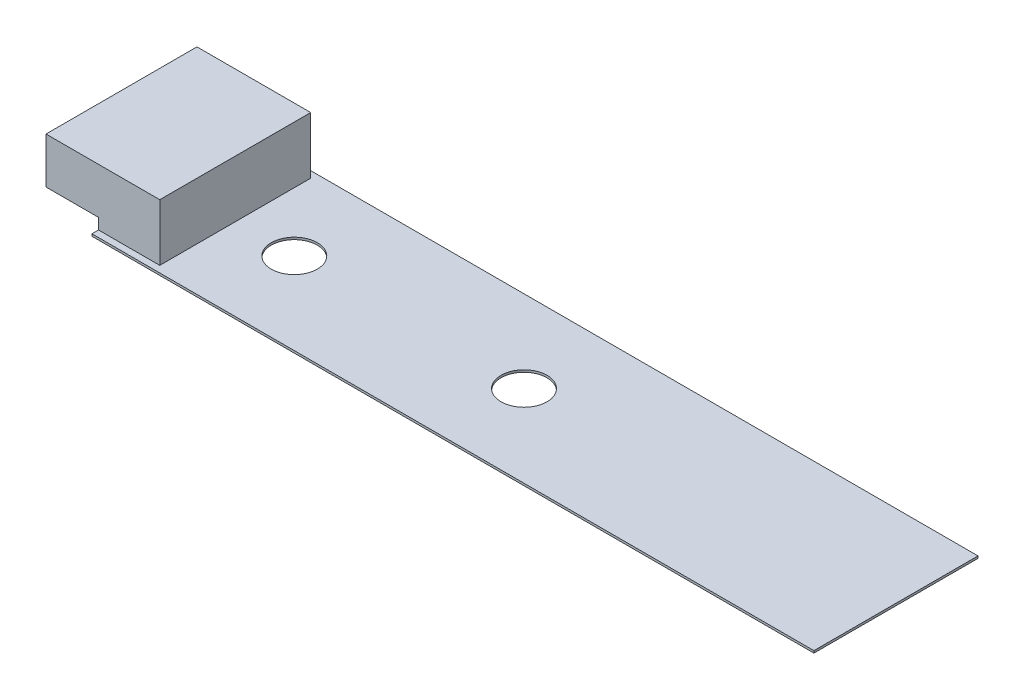
ISO-10303-21;
HEADER;
FILE_DESCRIPTION(('STEP AP214'),'2;1');
FILE_NAME('part.step','',(''),(''),'','','');
FILE_SCHEMA(('AUTOMOTIVE_DESIGN { 1 0 10303 214 1 1 1 1 }'));
ENDSEC;
DATA;
#1=APPLICATION_CONTEXT('core data for automotive mechanical design processes');
#2=APPLICATION_PROTOCOL_DEFINITION('international standard','automotive_design',2000,#1);
#3=PRODUCT_CONTEXT('',#1,'mechanical');
#4=PRODUCT('Part','Part','',(#3));
#5=PRODUCT_RELATED_PRODUCT_CATEGORY('part','',(#4));
#6=PRODUCT_DEFINITION_FORMATION('','',#4);
#7=PRODUCT_DEFINITION_CONTEXT('part definition',#1,'design');
#8=PRODUCT_DEFINITION('design','',#6,#7);
#9=PRODUCT_DEFINITION_SHAPE('','',#8);
#10=(LENGTH_UNIT() NAMED_UNIT(*) SI_UNIT(.MILLI.,.METRE.));
#11=(NAMED_UNIT(*) PLANE_ANGLE_UNIT() SI_UNIT($,.RADIAN.));
#12=(NAMED_UNIT(*) SI_UNIT($,.STERADIAN.) SOLID_ANGLE_UNIT());
#13=UNCERTAINTY_MEASURE_WITH_UNIT(LENGTH_MEASURE(1.E-05),#10,'distance_accuracy_value','');
#14=(GEOMETRIC_REPRESENTATION_CONTEXT(3) GLOBAL_UNCERTAINTY_ASSIGNED_CONTEXT((#13)) GLOBAL_UNIT_ASSIGNED_CONTEXT((#10,
#11,#12)) REPRESENTATION_CONTEXT('',''));
#15=CARTESIAN_POINT('',(0.,0.,0.));
#16=DIRECTION('',(0.,0.,1.));
#17=DIRECTION('',(1.,0.,0.));
#18=AXIS2_PLACEMENT_3D('',#15,#16,#17);
#19=CARTESIAN_POINT('',(0.,0.1,0.));
#20=DIRECTION('',(0.,-1.,0.));
#21=DIRECTION('',(0.,0.,-1.));
#22=AXIS2_PLACEMENT_3D('',#19,#20,#21);
#23=PLANE('',#22);
#24=CARTESIAN_POINT('',(5.5,0.0999999999999998,-3.75));
#25=DIRECTION('',(0.,-1.,0.));
#26=DIRECTION('',(0.,0.,-1.));
#27=AXIS2_PLACEMENT_3D('',#24,#25,#26);
#28=CIRCLE('',#27,1.05);
#29=CARTESIAN_POINT('',(5.5,0.0999999999999998,-4.8));
#30=VERTEX_POINT('',#29);
#31=EDGE_CURVE('E244',#30,#30,#28,.T.);
#32=ORIENTED_EDGE('',*,*,#31,.T.);
#33=EDGE_LOOP('',(#32));
#34=FACE_BOUND('',#33,.T.);
#35=CARTESIAN_POINT('',(16.,0.0999999999999998,-3.75));
#36=DIRECTION('',(0.,-1.,0.));
#37=DIRECTION('',(0.,0.,-1.));
#38=AXIS2_PLACEMENT_3D('',#35,#36,#37);
#39=CIRCLE('',#38,1.05);
#40=CARTESIAN_POINT('',(16.,0.0999999999999998,-4.8));
#41=VERTEX_POINT('',#40);
#42=EDGE_CURVE('E249',#41,#41,#39,.T.);
#43=ORIENTED_EDGE('',*,*,#42,.T.);
#44=EDGE_LOOP('',(#43));
#45=FACE_BOUND('',#44,.T.);
#46=DIRECTION('',(-1.,0.,0.));
#47=VECTOR('',#46,1.);
#48=CARTESIAN_POINT('',(-2.4,0.1,-7.2));
#49=LINE('',#48,#47);
#50=CARTESIAN_POINT('',(2.8,0.1,-7.2));
#51=VERTEX_POINT('',#50);
#52=CARTESIAN_POINT('',(0.,0.1,-7.2));
#53=VERTEX_POINT('',#52);
#54=EDGE_CURVE('E141',#51,#53,#49,.T.);
#55=ORIENTED_EDGE('',*,*,#54,.F.);
#56=DIRECTION('',(0.,0.,-1.));
#57=VECTOR('',#56,1.);
#58=CARTESIAN_POINT('',(2.8,0.1,-7.2));
#59=LINE('',#58,#57);
#60=CARTESIAN_POINT('',(2.8,0.1,-0.3));
#61=VERTEX_POINT('',#60);
#62=EDGE_CURVE('E214',#61,#51,#59,.T.);
#63=ORIENTED_EDGE('',*,*,#62,.F.);
#64=DIRECTION('',(1.,0.,0.));
#65=VECTOR('',#64,1.);
#66=CARTESIAN_POINT('',(-2.4,0.1,-0.3));
#67=LINE('',#66,#65);
#68=CARTESIAN_POINT('',(0.,0.1,-0.3));
#69=VERTEX_POINT('',#68);
#70=EDGE_CURVE('E184',#69,#61,#67,.T.);
#71=ORIENTED_EDGE('',*,*,#70,.F.);
#72=DIRECTION('',(0.,0.,1.));
#73=VECTOR('',#72,1.);
#74=CARTESIAN_POINT('',(0.,0.1,0.));
#75=LINE('',#74,#73);
#76=CARTESIAN_POINT('',(0.,0.1,0.));
#77=VERTEX_POINT('',#76);
#78=EDGE_CURVE('E161',#69,#77,#75,.T.);
#79=ORIENTED_EDGE('',*,*,#78,.T.);
#80=DIRECTION('',(1.,0.,0.));
#81=VECTOR('',#80,1.);
#82=CARTESIAN_POINT('',(0.,0.1,0.));
#83=LINE('',#82,#81);
#84=CARTESIAN_POINT('',(33.,0.1,0.));
#85=VERTEX_POINT('',#84);
#86=EDGE_CURVE('E159',#77,#85,#83,.T.);
#87=ORIENTED_EDGE('',*,*,#86,.T.);
#88=DIRECTION('',(0.,0.,-1.));
#89=VECTOR('',#88,1.);
#90=CARTESIAN_POINT('',(33.,0.1,0.));
#91=LINE('',#90,#89);
#92=CARTESIAN_POINT('',(33.,0.1,-7.5));
#93=VERTEX_POINT('',#92);
#94=EDGE_CURVE('E163',#85,#93,#91,.T.);
#95=ORIENTED_EDGE('',*,*,#94,.T.);
#96=DIRECTION('',(-1.,0.,0.));
#97=VECTOR('',#96,1.);
#98=CARTESIAN_POINT('',(0.,0.1,-7.5));
#99=LINE('',#98,#97);
#100=CARTESIAN_POINT('',(0.,0.1,-7.5));
#101=VERTEX_POINT('',#100);
#102=EDGE_CURVE('E165',#93,#101,#99,.T.);
#103=ORIENTED_EDGE('',*,*,#102,.T.);
#104=EDGE_CURVE('E156',#101,#53,#75,.T.);
#105=ORIENTED_EDGE('',*,*,#104,.T.);
#106=EDGE_LOOP('',(#55,#63,#71,#79,#87,#95,#103,#105));
#107=FACE_BOUND('',#106,.T.);
#108=ADVANCED_FACE('F32',(#34,#45,#107),#23,.F.);
#109=CARTESIAN_POINT('',(0.,0.1,0.));
#110=DIRECTION('',(1.,0.,0.));
#111=DIRECTION('',(0.,0.,-1.));
#112=AXIS2_PLACEMENT_3D('',#109,#110,#111);
#113=PLANE('',#112);
#114=DIRECTION('',(0.,0.,1.));
#115=VECTOR('',#114,1.);
#116=CARTESIAN_POINT('',(0.,0.,0.));
#117=LINE('',#116,#115);
#118=CARTESIAN_POINT('',(0.,0.,-7.5));
#119=VERTEX_POINT('',#118);
#120=CARTESIAN_POINT('',(0.,0.,0.));
#121=VERTEX_POINT('',#120);
#122=EDGE_CURVE('E147',#119,#121,#117,.T.);
#123=ORIENTED_EDGE('',*,*,#122,.T.);
#124=DIRECTION('',(0.,-1.,0.));
#125=VECTOR('',#124,1.);
#126=CARTESIAN_POINT('',(0.,0.1,0.));
#127=LINE('',#126,#125);
#128=EDGE_CURVE('E181',#77,#121,#127,.T.);
#129=ORIENTED_EDGE('',*,*,#128,.F.);
#130=ORIENTED_EDGE('',*,*,#78,.F.);
#131=DIRECTION('',(0.,-1.,0.));
#132=VECTOR('',#131,1.);
#133=CARTESIAN_POINT('',(0.,2.7,-0.3));
#134=LINE('',#133,#132);
#135=CARTESIAN_POINT('',(0.,0.599999999999997,-0.3));
#136=VERTEX_POINT('',#135);
#137=EDGE_CURVE('E185',#136,#69,#134,.T.);
#138=ORIENTED_EDGE('',*,*,#137,.F.);
#139=DIRECTION('',(0.,0.707106781186545,0.70710678118655));
#140=VECTOR('',#139,1.);
#141=CARTESIAN_POINT('',(0.,0.5,-0.399999999999997));
#142=LINE('',#141,#140);
#143=CARTESIAN_POINT('',(0.,0.1,-0.8));
#144=VERTEX_POINT('',#143);
#145=EDGE_CURVE('E40',#136,#144,#142,.F.);
#146=ORIENTED_EDGE('',*,*,#145,.T.);
#147=CARTESIAN_POINT('',(0.,0.1,-6.7));
#148=VERTEX_POINT('',#147);
#149=EDGE_CURVE('E160',#148,#144,#75,.T.);
#150=ORIENTED_EDGE('',*,*,#149,.F.);
#151=DIRECTION('',(0.,-0.707106781186545,0.70710678118655));
#152=VECTOR('',#151,1.);
#153=CARTESIAN_POINT('',(0.,-3.25,-3.34999999999997));
#154=LINE('',#153,#152);
#155=CARTESIAN_POINT('',(0.,0.599999999999997,-7.2));
#156=VERTEX_POINT('',#155);
#157=EDGE_CURVE('E11',#148,#156,#154,.F.);
#158=ORIENTED_EDGE('',*,*,#157,.T.);
#159=DIRECTION('',(0.,1.,0.));
#160=VECTOR('',#159,1.);
#161=CARTESIAN_POINT('',(0.,2.7,-7.2));
#162=LINE('',#161,#160);
#163=EDGE_CURVE('E46',#53,#156,#162,.T.);
#164=ORIENTED_EDGE('',*,*,#163,.F.);
#165=ORIENTED_EDGE('',*,*,#104,.F.);
#166=DIRECTION('',(0.,-1.,0.));
#167=VECTOR('',#166,1.);
#168=CARTESIAN_POINT('',(0.,0.1,-7.5));
#169=LINE('',#168,#167);
#170=EDGE_CURVE('E166',#101,#119,#169,.T.);
#171=ORIENTED_EDGE('',*,*,#170,.T.);
#172=EDGE_LOOP('',(#123,#129,#130,#138,#146,#150,#158,#164,#165,#171));
#173=FACE_BOUND('',#172,.T.);
#174=ADVANCED_FACE('F201',(#173),#113,.F.);
#175=CARTESIAN_POINT('',(0.,0.1,0.));
#176=DIRECTION('',(0.,0.,-1.));
#177=DIRECTION('',(-1.,0.,0.));
#178=AXIS2_PLACEMENT_3D('',#175,#176,#177);
#179=PLANE('',#178);
#180=DIRECTION('',(1.,0.,0.));
#181=VECTOR('',#180,1.);
#182=CARTESIAN_POINT('',(0.,0.,0.));
#183=LINE('',#182,#181);
#184=CARTESIAN_POINT('',(33.,0.,0.));
#185=VERTEX_POINT('',#184);
#186=EDGE_CURVE('E150',#121,#185,#183,.T.);
#187=ORIENTED_EDGE('',*,*,#186,.T.);
#188=DIRECTION('',(0.,-1.,0.));
#189=VECTOR('',#188,1.);
#190=CARTESIAN_POINT('',(33.,0.1,0.));
#191=LINE('',#190,#189);
#192=EDGE_CURVE('E178',#85,#185,#191,.T.);
#193=ORIENTED_EDGE('',*,*,#192,.F.);
#194=ORIENTED_EDGE('',*,*,#86,.F.);
#195=ORIENTED_EDGE('',*,*,#128,.T.);
#196=EDGE_LOOP('',(#187,#193,#194,#195));
#197=FACE_BOUND('',#196,.T.);
#198=ADVANCED_FACE('F219',(#197),#179,.F.);
#199=CARTESIAN_POINT('',(33.,0.1,0.));
#200=DIRECTION('',(-1.,0.,0.));
#201=DIRECTION('',(0.,0.,1.));
#202=AXIS2_PLACEMENT_3D('',#199,#200,#201);
#203=PLANE('',#202);
#204=DIRECTION('',(0.,0.,-1.));
#205=VECTOR('',#204,1.);
#206=CARTESIAN_POINT('',(33.,0.,0.));
#207=LINE('',#206,#205);
#208=CARTESIAN_POINT('',(33.,0.,-7.5));
#209=VERTEX_POINT('',#208);
#210=EDGE_CURVE('E169',#185,#209,#207,.T.);
#211=ORIENTED_EDGE('',*,*,#210,.T.);
#212=DIRECTION('',(0.,-1.,0.));
#213=VECTOR('',#212,1.);
#214=CARTESIAN_POINT('',(33.,0.1,-7.5));
#215=LINE('',#214,#213);
#216=EDGE_CURVE('E175',#93,#209,#215,.T.);
#217=ORIENTED_EDGE('',*,*,#216,.F.);
#218=ORIENTED_EDGE('',*,*,#94,.F.);
#219=ORIENTED_EDGE('',*,*,#192,.T.);
#220=EDGE_LOOP('',(#211,#217,#218,#219));
#221=FACE_BOUND('',#220,.T.);
#222=ADVANCED_FACE('F226',(#221),#203,.F.);
#223=CARTESIAN_POINT('',(0.,0.1,-7.5));
#224=DIRECTION('',(0.,0.,1.));
#225=DIRECTION('',(1.,0.,0.));
#226=AXIS2_PLACEMENT_3D('',#223,#224,#225);
#227=PLANE('',#226);
#228=DIRECTION('',(-1.,0.,0.));
#229=VECTOR('',#228,1.);
#230=CARTESIAN_POINT('',(0.,0.,-7.5));
#231=LINE('',#230,#229);
#232=EDGE_CURVE('E171',#209,#119,#231,.T.);
#233=ORIENTED_EDGE('',*,*,#232,.T.);
#234=ORIENTED_EDGE('',*,*,#170,.F.);
#235=ORIENTED_EDGE('',*,*,#102,.F.);
#236=ORIENTED_EDGE('',*,*,#216,.T.);
#237=EDGE_LOOP('',(#233,#234,#235,#236));
#238=FACE_BOUND('',#237,.T.);
#239=ADVANCED_FACE('F230',(#238),#227,.F.);
#240=CARTESIAN_POINT('',(0.,0.,0.));
#241=DIRECTION('',(0.,-1.,0.));
#242=DIRECTION('',(0.,0.,-1.));
#243=AXIS2_PLACEMENT_3D('',#240,#241,#242);
#244=PLANE('',#243);
#245=CARTESIAN_POINT('',(5.5,0.,-3.75));
#246=DIRECTION('',(0.,-1.,0.));
#247=DIRECTION('',(0.,0.,-1.));
#248=AXIS2_PLACEMENT_3D('',#245,#246,#247);
#249=CIRCLE('',#248,1.05);
#250=CARTESIAN_POINT('',(5.5,0.,-4.8));
#251=VERTEX_POINT('',#250);
#252=EDGE_CURVE('E252',#251,#251,#249,.T.);
#253=ORIENTED_EDGE('',*,*,#252,.F.);
#254=EDGE_LOOP('',(#253));
#255=FACE_BOUND('',#254,.T.);
#256=CARTESIAN_POINT('',(16.,0.,-3.75));
#257=DIRECTION('',(0.,-1.,0.));
#258=DIRECTION('',(0.,0.,-1.));
#259=AXIS2_PLACEMENT_3D('',#256,#257,#258);
#260=CIRCLE('',#259,1.05);
#261=CARTESIAN_POINT('',(16.,0.,-4.8));
#262=VERTEX_POINT('',#261);
#263=EDGE_CURVE('E253',#262,#262,#260,.T.);
#264=ORIENTED_EDGE('',*,*,#263,.F.);
#265=EDGE_LOOP('',(#264));
#266=FACE_BOUND('',#265,.T.);
#267=ORIENTED_EDGE('',*,*,#122,.F.);
#268=ORIENTED_EDGE('',*,*,#232,.F.);
#269=ORIENTED_EDGE('',*,*,#210,.F.);
#270=ORIENTED_EDGE('',*,*,#186,.F.);
#271=EDGE_LOOP('',(#267,#268,#269,#270));
#272=FACE_BOUND('',#271,.T.);
#273=ADVANCED_FACE('F262',(#255,#266,#272),#244,.T.);
#274=CARTESIAN_POINT('',(0.,0.1,0.));
#275=DIRECTION('',(0.,1.,0.));
#276=DIRECTION('',(0.,0.,1.));
#277=AXIS2_PLACEMENT_3D('',#274,#275,#276);
#278=PLANE('',#277);
#279=ORIENTED_EDGE('',*,*,#149,.T.);
#280=DIRECTION('',(-1.,0.,0.));
#281=VECTOR('',#280,1.);
#282=CARTESIAN_POINT('',(0.,0.1,-0.8));
#283=LINE('',#282,#281);
#284=CARTESIAN_POINT('',(-2.4,0.1,-0.8));
#285=VERTEX_POINT('',#284);
#286=EDGE_CURVE('E191',#144,#285,#283,.T.);
#287=ORIENTED_EDGE('',*,*,#286,.T.);
#288=DIRECTION('',(0.,0.,1.));
#289=VECTOR('',#288,1.);
#290=CARTESIAN_POINT('',(-2.4,0.1,-7.2));
#291=LINE('',#290,#289);
#292=CARTESIAN_POINT('',(-2.4,0.1,-6.7));
#293=VERTEX_POINT('',#292);
#294=EDGE_CURVE('E237',#293,#285,#291,.T.);
#295=ORIENTED_EDGE('',*,*,#294,.F.);
#296=DIRECTION('',(1.,0.,0.));
#297=VECTOR('',#296,1.);
#298=CARTESIAN_POINT('',(0.,0.1,-6.7));
#299=LINE('',#298,#297);
#300=EDGE_CURVE('E189',#293,#148,#299,.T.);
#301=ORIENTED_EDGE('',*,*,#300,.T.);
#302=EDGE_LOOP('',(#279,#287,#295,#301));
#303=FACE_BOUND('',#302,.T.);
#304=ADVANCED_FACE('F206',(#303),#278,.F.);
#305=CARTESIAN_POINT('',(-2.4,2.7,-7.2));
#306=DIRECTION('',(1.,0.,0.));
#307=DIRECTION('',(0.,0.,-1.));
#308=AXIS2_PLACEMENT_3D('',#305,#306,#307);
#309=PLANE('',#308);
#310=ORIENTED_EDGE('',*,*,#294,.T.);
#311=DIRECTION('',(0.,-0.707106781186545,-0.70710678118655));
#312=VECTOR('',#311,1.);
#313=CARTESIAN_POINT('',(-2.4,0.599999999999997,-0.3));
#314=LINE('',#313,#312);
#315=CARTESIAN_POINT('',(-2.4,0.599999999999997,-0.3));
#316=VERTEX_POINT('',#315);
#317=EDGE_CURVE('E146',#285,#316,#314,.F.);
#318=ORIENTED_EDGE('',*,*,#317,.T.);
#319=DIRECTION('',(0.,-1.,0.));
#320=VECTOR('',#319,1.);
#321=CARTESIAN_POINT('',(-2.4,2.7,-0.3));
#322=LINE('',#321,#320);
#323=CARTESIAN_POINT('',(-2.4,2.7,-0.3));
#324=VERTEX_POINT('',#323);
#325=EDGE_CURVE('E124',#324,#316,#322,.T.);
#326=ORIENTED_EDGE('',*,*,#325,.F.);
#327=DIRECTION('',(0.,0.,1.));
#328=VECTOR('',#327,1.);
#329=CARTESIAN_POINT('',(-2.4,2.7,-7.2));
#330=LINE('',#329,#328);
#331=CARTESIAN_POINT('',(-2.4,2.7,-7.2));
#332=VERTEX_POINT('',#331);
#333=EDGE_CURVE('E132',#332,#324,#330,.T.);
#334=ORIENTED_EDGE('',*,*,#333,.F.);
#335=DIRECTION('',(0.,-1.,0.));
#336=VECTOR('',#335,1.);
#337=CARTESIAN_POINT('',(-2.4,2.7,-7.2));
#338=LINE('',#337,#336);
#339=CARTESIAN_POINT('',(-2.4,0.599999999999997,-7.2));
#340=VERTEX_POINT('',#339);
#341=EDGE_CURVE('E240',#332,#340,#338,.T.);
#342=ORIENTED_EDGE('',*,*,#341,.T.);
#343=DIRECTION('',(0.,0.707106781186545,-0.70710678118655));
#344=VECTOR('',#343,1.);
#345=CARTESIAN_POINT('',(-2.4,0.599999999999997,-7.2));
#346=LINE('',#345,#344);
#347=EDGE_CURVE('E193',#340,#293,#346,.F.);
#348=ORIENTED_EDGE('',*,*,#347,.T.);
#349=EDGE_LOOP('',(#310,#318,#326,#334,#342,#348));
#350=FACE_BOUND('',#349,.T.);
#351=ADVANCED_FACE('F144',(#350),#309,.F.);
#352=CARTESIAN_POINT('',(-2.4,2.7,-0.3));
#353=DIRECTION('',(0.,0.,-1.));
#354=DIRECTION('',(-1.,0.,0.));
#355=AXIS2_PLACEMENT_3D('',#352,#353,#354);
#356=PLANE('',#355);
#357=ORIENTED_EDGE('',*,*,#325,.T.);
#358=DIRECTION('',(1.,0.,0.));
#359=VECTOR('',#358,1.);
#360=CARTESIAN_POINT('',(-2.4,0.599999999999997,-0.3));
#361=LINE('',#360,#359);
#362=EDGE_CURVE('E187',#316,#136,#361,.T.);
#363=ORIENTED_EDGE('',*,*,#362,.T.);
#364=ORIENTED_EDGE('',*,*,#137,.T.);
#365=ORIENTED_EDGE('',*,*,#70,.T.);
#366=DIRECTION('',(0.,-1.,0.));
#367=VECTOR('',#366,1.);
#368=CARTESIAN_POINT('',(2.8,2.7,-0.3));
#369=LINE('',#368,#367);
#370=CARTESIAN_POINT('',(2.8,2.7,-0.3));
#371=VERTEX_POINT('',#370);
#372=EDGE_CURVE('E128',#371,#61,#369,.T.);
#373=ORIENTED_EDGE('',*,*,#372,.F.);
#374=DIRECTION('',(1.,0.,0.));
#375=VECTOR('',#374,1.);
#376=CARTESIAN_POINT('',(-2.4,2.7,-0.3));
#377=LINE('',#376,#375);
#378=EDGE_CURVE('E119',#324,#371,#377,.T.);
#379=ORIENTED_EDGE('',*,*,#378,.F.);
#380=EDGE_LOOP('',(#357,#363,#364,#365,#373,#379));
#381=FACE_BOUND('',#380,.T.);
#382=ADVANCED_FACE('F121',(#381),#356,.F.);
#383=CARTESIAN_POINT('',(2.8,2.7,-7.2));
#384=DIRECTION('',(-1.,0.,0.));
#385=DIRECTION('',(0.,0.,1.));
#386=AXIS2_PLACEMENT_3D('',#383,#384,#385);
#387=PLANE('',#386);
#388=ORIENTED_EDGE('',*,*,#62,.T.);
#389=DIRECTION('',(0.,-1.,0.));
#390=VECTOR('',#389,1.);
#391=CARTESIAN_POINT('',(2.8,2.7,-7.2));
#392=LINE('',#391,#390);
#393=CARTESIAN_POINT('',(2.8,2.7,-7.2));
#394=VERTEX_POINT('',#393);
#395=EDGE_CURVE('E152',#394,#51,#392,.T.);
#396=ORIENTED_EDGE('',*,*,#395,.F.);
#397=DIRECTION('',(0.,0.,-1.));
#398=VECTOR('',#397,1.);
#399=CARTESIAN_POINT('',(2.8,2.7,-7.2));
#400=LINE('',#399,#398);
#401=EDGE_CURVE('E131',#371,#394,#400,.T.);
#402=ORIENTED_EDGE('',*,*,#401,.F.);
#403=ORIENTED_EDGE('',*,*,#372,.T.);
#404=EDGE_LOOP('',(#388,#396,#402,#403));
#405=FACE_BOUND('',#404,.T.);
#406=ADVANCED_FACE('F236',(#405),#387,.F.);
#407=CARTESIAN_POINT('',(-2.4,2.7,-7.2));
#408=DIRECTION('',(0.,0.,1.));
#409=DIRECTION('',(1.,0.,0.));
#410=AXIS2_PLACEMENT_3D('',#407,#408,#409);
#411=PLANE('',#410);
#412=ORIENTED_EDGE('',*,*,#163,.T.);
#413=DIRECTION('',(-1.,0.,0.));
#414=VECTOR('',#413,1.);
#415=CARTESIAN_POINT('',(-2.4,0.599999999999997,-7.2));
#416=LINE('',#415,#414);
#417=EDGE_CURVE('E197',#156,#340,#416,.T.);
#418=ORIENTED_EDGE('',*,*,#417,.T.);
#419=ORIENTED_EDGE('',*,*,#341,.F.);
#420=DIRECTION('',(-1.,0.,0.));
#421=VECTOR('',#420,1.);
#422=CARTESIAN_POINT('',(-2.4,2.7,-7.2));
#423=LINE('',#422,#421);
#424=EDGE_CURVE('E137',#394,#332,#423,.T.);
#425=ORIENTED_EDGE('',*,*,#424,.F.);
#426=ORIENTED_EDGE('',*,*,#395,.T.);
#427=ORIENTED_EDGE('',*,*,#54,.T.);
#428=EDGE_LOOP('',(#412,#418,#419,#425,#426,#427));
#429=FACE_BOUND('',#428,.T.);
#430=ADVANCED_FACE('F239',(#429),#411,.F.);
#431=CARTESIAN_POINT('',(0.,2.7,0.));
#432=DIRECTION('',(0.,1.,0.));
#433=DIRECTION('',(0.,0.,1.));
#434=AXIS2_PLACEMENT_3D('',#431,#432,#433);
#435=PLANE('',#434);
#436=ORIENTED_EDGE('',*,*,#333,.T.);
#437=ORIENTED_EDGE('',*,*,#378,.T.);
#438=ORIENTED_EDGE('',*,*,#401,.T.);
#439=ORIENTED_EDGE('',*,*,#424,.T.);
#440=EDGE_LOOP('',(#436,#437,#438,#439));
#441=FACE_BOUND('',#440,.T.);
#442=ADVANCED_FACE('F135',(#441),#435,.T.);
#443=CARTESIAN_POINT('',(-2.4,0.599999999999997,-0.3));
#444=DIRECTION('',(0.,0.70710678118655,-0.707106781186545));
#445=DIRECTION('',(1.,0.,0.));
#446=AXIS2_PLACEMENT_3D('',#443,#444,#445);
#447=PLANE('',#446);
#448=ORIENTED_EDGE('',*,*,#317,.F.);
#449=ORIENTED_EDGE('',*,*,#286,.F.);
#450=ORIENTED_EDGE('',*,*,#145,.F.);
#451=ORIENTED_EDGE('',*,*,#362,.F.);
#452=EDGE_LOOP('',(#448,#449,#450,#451));
#453=FACE_BOUND('',#452,.T.);
#454=ADVANCED_FACE('F209',(#453),#447,.F.);
#455=CARTESIAN_POINT('',(-2.4,0.599999999999997,-7.2));
#456=DIRECTION('',(0.,0.70710678118655,0.707106781186545));
#457=DIRECTION('',(-1.,0.,0.));
#458=AXIS2_PLACEMENT_3D('',#455,#456,#457);
#459=PLANE('',#458);
#460=ORIENTED_EDGE('',*,*,#157,.F.);
#461=ORIENTED_EDGE('',*,*,#300,.F.);
#462=ORIENTED_EDGE('',*,*,#347,.F.);
#463=ORIENTED_EDGE('',*,*,#417,.F.);
#464=EDGE_LOOP('',(#460,#461,#462,#463));
#465=FACE_BOUND('',#464,.T.);
#466=ADVANCED_FACE('F34',(#465),#459,.F.);
#467=CARTESIAN_POINT('',(16.,2.6,-3.75));
#468=DIRECTION('',(0.,-1.,0.));
#469=DIRECTION('',(0.,0.,-1.));
#470=AXIS2_PLACEMENT_3D('',#467,#468,#469);
#471=CYLINDRICAL_SURFACE('',#470,1.05);
#472=ORIENTED_EDGE('',*,*,#263,.T.);
#473=EDGE_LOOP('',(#472));
#474=FACE_BOUND('',#473,.T.);
#475=ORIENTED_EDGE('',*,*,#42,.F.);
#476=EDGE_LOOP('',(#475));
#477=FACE_BOUND('',#476,.T.);
#478=ADVANCED_FACE('F269',(#474,#477),#471,.F.);
#479=CARTESIAN_POINT('',(5.5,2.6,-3.75));
#480=DIRECTION('',(0.,-1.,0.));
#481=DIRECTION('',(0.,0.,-1.));
#482=AXIS2_PLACEMENT_3D('',#479,#480,#481);
#483=CYLINDRICAL_SURFACE('',#482,1.05);
#484=ORIENTED_EDGE('',*,*,#252,.T.);
#485=EDGE_LOOP('',(#484));
#486=FACE_BOUND('',#485,.T.);
#487=ORIENTED_EDGE('',*,*,#31,.F.);
#488=EDGE_LOOP('',(#487));
#489=FACE_BOUND('',#488,.T.);
#490=ADVANCED_FACE('F259',(#486,#489),#483,.F.);
#491=CLOSED_SHELL('',(#108,#174,#198,#222,#239,#273,#304,#351,#382,#406,#430,#442,#454,#466,
#478,#490));
#492=MANIFOLD_SOLID_BREP('B2',#491);
#493=ADVANCED_BREP_SHAPE_REPRESENTATION('',(#18,#492),#14);
#494=SHAPE_DEFINITION_REPRESENTATION(#9,#493);
ENDSEC;
END-ISO-10303-21;
